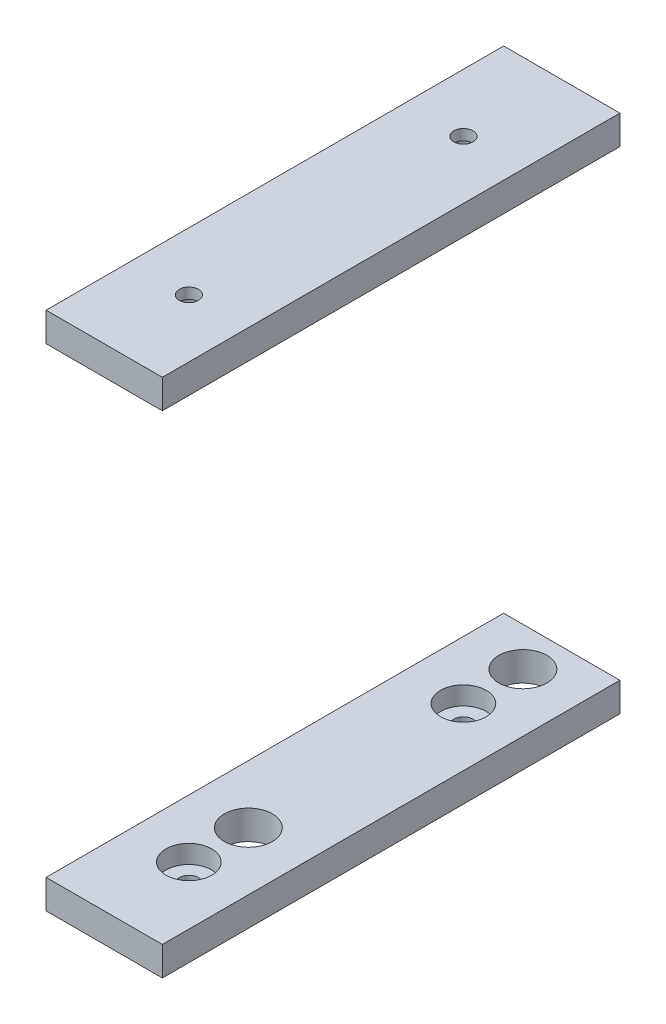
ISO-10303-21;
HEADER;
FILE_DESCRIPTION(('STEP AP214'),'2;1');
FILE_NAME('part.step','',(''),(''),'','','');
FILE_SCHEMA(('AUTOMOTIVE_DESIGN { 1 0 10303 214 1 1 1 1 }'));
ENDSEC;
DATA;
#1=APPLICATION_CONTEXT('core data for automotive mechanical design processes');
#2=APPLICATION_PROTOCOL_DEFINITION('international standard','automotive_design',2000,#1);
#3=PRODUCT_CONTEXT('',#1,'mechanical');
#4=PRODUCT('Part','Part','',(#3));
#5=PRODUCT_RELATED_PRODUCT_CATEGORY('part','',(#4));
#6=PRODUCT_DEFINITION_FORMATION('','',#4);
#7=PRODUCT_DEFINITION_CONTEXT('part definition',#1,'design');
#8=PRODUCT_DEFINITION('design','',#6,#7);
#9=PRODUCT_DEFINITION_SHAPE('','',#8);
#10=(LENGTH_UNIT() NAMED_UNIT(*) SI_UNIT(.MILLI.,.METRE.));
#11=(NAMED_UNIT(*) PLANE_ANGLE_UNIT() SI_UNIT($,.RADIAN.));
#12=(NAMED_UNIT(*) SI_UNIT($,.STERADIAN.) SOLID_ANGLE_UNIT());
#13=UNCERTAINTY_MEASURE_WITH_UNIT(LENGTH_MEASURE(1.E-05),#10,'distance_accuracy_value','');
#14=(GEOMETRIC_REPRESENTATION_CONTEXT(3) GLOBAL_UNCERTAINTY_ASSIGNED_CONTEXT((#13)) GLOBAL_UNIT_ASSIGNED_CONTEXT((#10,
#11,#12)) REPRESENTATION_CONTEXT('',''));
#15=CARTESIAN_POINT('',(0.,0.,0.));
#16=DIRECTION('',(0.,0.,1.));
#17=DIRECTION('',(1.,0.,0.));
#18=AXIS2_PLACEMENT_3D('',#15,#16,#17);
#19=CARTESIAN_POINT('',(104.175,-6.35,-115.));
#20=DIRECTION('',(0.,0.,-1.));
#21=DIRECTION('',(-1.,0.,0.));
#22=AXIS2_PLACEMENT_3D('',#19,#20,#21);
#23=PLANE('',#22);
#24=DIRECTION('',(-1.,0.,0.));
#25=VECTOR('',#24,1.);
#26=CARTESIAN_POINT('',(104.175,0.,-115.));
#27=LINE('',#26,#25);
#28=CARTESIAN_POINT('',(104.175,0.,-115.));
#29=VERTEX_POINT('',#28);
#30=CARTESIAN_POINT('',(78.775,0.,-115.));
#31=VERTEX_POINT('',#30);
#32=EDGE_CURVE('E129',#29,#31,#27,.T.);
#33=ORIENTED_EDGE('',*,*,#32,.F.);
#34=DIRECTION('',(0.,1.,0.));
#35=VECTOR('',#34,1.);
#36=CARTESIAN_POINT('',(104.175,-6.35,-115.));
#37=LINE('',#36,#35);
#38=CARTESIAN_POINT('',(104.175,-6.35,-115.));
#39=VERTEX_POINT('',#38);
#40=EDGE_CURVE('E12',#39,#29,#37,.T.);
#41=ORIENTED_EDGE('',*,*,#40,.F.);
#42=DIRECTION('',(-1.,0.,0.));
#43=VECTOR('',#42,1.);
#44=CARTESIAN_POINT('',(104.175,-6.35,-115.));
#45=LINE('',#44,#43);
#46=CARTESIAN_POINT('',(78.775,-6.35,-115.));
#47=VERTEX_POINT('',#46);
#48=EDGE_CURVE('E118',#39,#47,#45,.T.);
#49=ORIENTED_EDGE('',*,*,#48,.T.);
#50=DIRECTION('',(0.,1.,0.));
#51=VECTOR('',#50,1.);
#52=CARTESIAN_POINT('',(78.775,-6.35,-115.));
#53=LINE('',#52,#51);
#54=EDGE_CURVE('E100',#47,#31,#53,.T.);
#55=ORIENTED_EDGE('',*,*,#54,.T.);
#56=EDGE_LOOP('',(#33,#41,#49,#55));
#57=FACE_BOUND('',#56,.T.);
#58=ADVANCED_FACE('F54',(#57),#23,.T.);
#59=CARTESIAN_POINT('',(104.175,-6.35,-15.));
#60=DIRECTION('',(1.,0.,0.));
#61=DIRECTION('',(0.,0.,-1.));
#62=AXIS2_PLACEMENT_3D('',#59,#60,#61);
#63=PLANE('',#62);
#64=DIRECTION('',(0.,0.,-1.));
#65=VECTOR('',#64,1.);
#66=CARTESIAN_POINT('',(104.175,0.,-15.));
#67=LINE('',#66,#65);
#68=CARTESIAN_POINT('',(104.175,0.,-15.));
#69=VERTEX_POINT('',#68);
#70=EDGE_CURVE('E125',#69,#29,#67,.T.);
#71=ORIENTED_EDGE('',*,*,#70,.F.);
#72=DIRECTION('',(0.,1.,0.));
#73=VECTOR('',#72,1.);
#74=CARTESIAN_POINT('',(104.175,-6.35,-15.));
#75=LINE('',#74,#73);
#76=CARTESIAN_POINT('',(104.175,-6.35,-15.));
#77=VERTEX_POINT('',#76);
#78=EDGE_CURVE('E63',#77,#69,#75,.T.);
#79=ORIENTED_EDGE('',*,*,#78,.F.);
#80=DIRECTION('',(0.,0.,-1.));
#81=VECTOR('',#80,1.);
#82=CARTESIAN_POINT('',(104.175,-6.35,-15.));
#83=LINE('',#82,#81);
#84=EDGE_CURVE('E112',#77,#39,#83,.T.);
#85=ORIENTED_EDGE('',*,*,#84,.T.);
#86=ORIENTED_EDGE('',*,*,#40,.T.);
#87=EDGE_LOOP('',(#71,#79,#85,#86));
#88=FACE_BOUND('',#87,.T.);
#89=ADVANCED_FACE('F202',(#88),#63,.T.);
#90=CARTESIAN_POINT('',(78.775,-6.35,-15.));
#91=DIRECTION('',(0.,0.,1.));
#92=DIRECTION('',(1.,0.,0.));
#93=AXIS2_PLACEMENT_3D('',#90,#91,#92);
#94=PLANE('',#93);
#95=DIRECTION('',(1.,0.,0.));
#96=VECTOR('',#95,1.);
#97=CARTESIAN_POINT('',(78.775,0.,-15.));
#98=LINE('',#97,#96);
#99=CARTESIAN_POINT('',(78.775,0.,-15.));
#100=VERTEX_POINT('',#99);
#101=EDGE_CURVE('E110',#100,#69,#98,.T.);
#102=ORIENTED_EDGE('',*,*,#101,.F.);
#103=DIRECTION('',(0.,1.,0.));
#104=VECTOR('',#103,1.);
#105=CARTESIAN_POINT('',(78.775,-6.35,-15.));
#106=LINE('',#105,#104);
#107=CARTESIAN_POINT('',(78.775,-6.35,-15.));
#108=VERTEX_POINT('',#107);
#109=EDGE_CURVE('E105',#108,#100,#106,.T.);
#110=ORIENTED_EDGE('',*,*,#109,.F.);
#111=DIRECTION('',(1.,0.,0.));
#112=VECTOR('',#111,1.);
#113=CARTESIAN_POINT('',(78.775,-6.35,-15.));
#114=LINE('',#113,#112);
#115=EDGE_CURVE('E102',#108,#77,#114,.T.);
#116=ORIENTED_EDGE('',*,*,#115,.T.);
#117=ORIENTED_EDGE('',*,*,#78,.T.);
#118=EDGE_LOOP('',(#102,#110,#116,#117));
#119=FACE_BOUND('',#118,.T.);
#120=ADVANCED_FACE('F104',(#119),#94,.T.);
#121=CARTESIAN_POINT('',(78.775,-6.35,-115.));
#122=DIRECTION('',(-1.,0.,0.));
#123=DIRECTION('',(0.,0.,1.));
#124=AXIS2_PLACEMENT_3D('',#121,#122,#123);
#125=PLANE('',#124);
#126=DIRECTION('',(0.,0.,1.));
#127=VECTOR('',#126,1.);
#128=CARTESIAN_POINT('',(78.775,0.,-115.));
#129=LINE('',#128,#127);
#130=EDGE_CURVE('E135',#31,#100,#129,.T.);
#131=ORIENTED_EDGE('',*,*,#130,.F.);
#132=ORIENTED_EDGE('',*,*,#54,.F.);
#133=DIRECTION('',(0.,0.,1.));
#134=VECTOR('',#133,1.);
#135=CARTESIAN_POINT('',(78.775,-6.35,-115.));
#136=LINE('',#135,#134);
#137=EDGE_CURVE('E113',#47,#108,#136,.T.);
#138=ORIENTED_EDGE('',*,*,#137,.T.);
#139=ORIENTED_EDGE('',*,*,#109,.T.);
#140=EDGE_LOOP('',(#131,#132,#138,#139));
#141=FACE_BOUND('',#140,.T.);
#142=ADVANCED_FACE('F120',(#141),#125,.T.);
#143=CARTESIAN_POINT('',(0.,-6.35,0.));
#144=DIRECTION('',(0.,1.,0.));
#145=DIRECTION('',(0.,0.,1.));
#146=AXIS2_PLACEMENT_3D('',#143,#144,#145);
#147=PLANE('',#146);
#148=CARTESIAN_POINT('',(91.475,-6.35,-33.5));
#149=DIRECTION('',(0.,-1.,0.));
#150=DIRECTION('',(0.,0.,-1.));
#151=AXIS2_PLACEMENT_3D('',#148,#149,#150);
#152=CIRCLE('',#151,5.);
#153=CARTESIAN_POINT('',(91.475,-6.35,-38.5));
#154=VERTEX_POINT('',#153);
#155=EDGE_CURVE('E167',#154,#154,#152,.T.);
#156=ORIENTED_EDGE('',*,*,#155,.F.);
#157=EDGE_LOOP('',(#156));
#158=FACE_BOUND('',#157,.T.);
#159=CARTESIAN_POINT('',(91.475,-6.35,-93.5));
#160=DIRECTION('',(0.,-1.,0.));
#161=DIRECTION('',(0.,0.,-1.));
#162=AXIS2_PLACEMENT_3D('',#159,#160,#161);
#163=CIRCLE('',#162,5.);
#164=CARTESIAN_POINT('',(91.475,-6.35,-98.5));
#165=VERTEX_POINT('',#164);
#166=EDGE_CURVE('E157',#165,#165,#163,.T.);
#167=ORIENTED_EDGE('',*,*,#166,.F.);
#168=EDGE_LOOP('',(#167));
#169=FACE_BOUND('',#168,.T.);
#170=ORIENTED_EDGE('',*,*,#48,.F.);
#171=ORIENTED_EDGE('',*,*,#84,.F.);
#172=ORIENTED_EDGE('',*,*,#115,.F.);
#173=ORIENTED_EDGE('',*,*,#137,.F.);
#174=EDGE_LOOP('',(#170,#171,#172,#173));
#175=FACE_BOUND('',#174,.T.);
#176=ADVANCED_FACE('F115',(#158,#169,#175),#147,.F.);
#177=CARTESIAN_POINT('',(0.,0.,0.));
#178=DIRECTION('',(0.,1.,0.));
#179=DIRECTION('',(0.,0.,1.));
#180=AXIS2_PLACEMENT_3D('',#177,#178,#179);
#181=PLANE('',#180);
#182=CARTESIAN_POINT('',(91.475,0.,-33.5));
#183=DIRECTION('',(0.,1.,0.));
#184=DIRECTION('',(0.,0.,1.));
#185=AXIS2_PLACEMENT_3D('',#182,#183,#184);
#186=CIRCLE('',#185,2.1);
#187=CARTESIAN_POINT('',(91.475,0.,-31.4));
#188=VERTEX_POINT('',#187);
#189=EDGE_CURVE('E59',#188,#188,#186,.T.);
#190=ORIENTED_EDGE('',*,*,#189,.F.);
#191=EDGE_LOOP('',(#190));
#192=FACE_BOUND('',#191,.T.);
#193=CARTESIAN_POINT('',(91.475,0.,-93.5));
#194=DIRECTION('',(0.,1.,0.));
#195=DIRECTION('',(0.,0.,1.));
#196=AXIS2_PLACEMENT_3D('',#193,#194,#195);
#197=CIRCLE('',#196,2.1);
#198=CARTESIAN_POINT('',(91.475,0.,-91.4));
#199=VERTEX_POINT('',#198);
#200=EDGE_CURVE('E131',#199,#199,#197,.T.);
#201=ORIENTED_EDGE('',*,*,#200,.F.);
#202=EDGE_LOOP('',(#201));
#203=FACE_BOUND('',#202,.T.);
#204=ORIENTED_EDGE('',*,*,#32,.T.);
#205=ORIENTED_EDGE('',*,*,#130,.T.);
#206=ORIENTED_EDGE('',*,*,#101,.T.);
#207=ORIENTED_EDGE('',*,*,#70,.T.);
#208=EDGE_LOOP('',(#204,#205,#206,#207));
#209=FACE_BOUND('',#208,.T.);
#210=ADVANCED_FACE('F177',(#192,#203,#209),#181,.T.);
#211=CARTESIAN_POINT('',(91.475,-6.35,-93.5));
#212=DIRECTION('',(0.,-1.,0.));
#213=DIRECTION('',(0.,0.,-1.));
#214=AXIS2_PLACEMENT_3D('',#211,#212,#213);
#215=CYLINDRICAL_SURFACE('',#214,2.1);
#216=ORIENTED_EDGE('',*,*,#200,.T.);
#217=EDGE_LOOP('',(#216));
#218=FACE_BOUND('',#217,.T.);
#219=CARTESIAN_POINT('',(91.475,-2.35,-93.5));
#220=DIRECTION('',(0.,-1.,0.));
#221=DIRECTION('',(0.,0.,-1.));
#222=AXIS2_PLACEMENT_3D('',#219,#220,#221);
#223=CIRCLE('',#222,2.1);
#224=CARTESIAN_POINT('',(91.475,-2.35,-95.6));
#225=VERTEX_POINT('',#224);
#226=EDGE_CURVE('E147',#225,#225,#223,.T.);
#227=ORIENTED_EDGE('',*,*,#226,.T.);
#228=EDGE_LOOP('',(#227));
#229=FACE_BOUND('',#228,.T.);
#230=ADVANCED_FACE('F198',(#218,#229),#215,.F.);
#231=CARTESIAN_POINT('',(93.575,-2.35,-93.5));
#232=DIRECTION('',(0.,1.,0.));
#233=DIRECTION('',(0.,0.,1.));
#234=AXIS2_PLACEMENT_3D('',#231,#232,#233);
#235=PLANE('',#234);
#236=ORIENTED_EDGE('',*,*,#226,.F.);
#237=EDGE_LOOP('',(#236));
#238=FACE_BOUND('',#237,.T.);
#239=CARTESIAN_POINT('',(91.475,-2.35,-93.5));
#240=DIRECTION('',(0.,-1.,0.));
#241=DIRECTION('',(0.,0.,-1.));
#242=AXIS2_PLACEMENT_3D('',#239,#240,#241);
#243=CIRCLE('',#242,5.);
#244=CARTESIAN_POINT('',(91.475,-2.35,-98.5));
#245=VERTEX_POINT('',#244);
#246=EDGE_CURVE('E153',#245,#245,#243,.T.);
#247=ORIENTED_EDGE('',*,*,#246,.T.);
#248=EDGE_LOOP('',(#247));
#249=FACE_BOUND('',#248,.T.);
#250=ADVANCED_FACE('F187',(#238,#249),#235,.F.);
#251=CARTESIAN_POINT('',(91.475,-6.35,-93.5));
#252=DIRECTION('',(0.,-1.,0.));
#253=DIRECTION('',(0.,0.,-1.));
#254=AXIS2_PLACEMENT_3D('',#251,#252,#253);
#255=CYLINDRICAL_SURFACE('',#254,5.);
#256=ORIENTED_EDGE('',*,*,#246,.F.);
#257=EDGE_LOOP('',(#256));
#258=FACE_BOUND('',#257,.T.);
#259=ORIENTED_EDGE('',*,*,#166,.T.);
#260=EDGE_LOOP('',(#259));
#261=FACE_BOUND('',#260,.T.);
#262=ADVANCED_FACE('F182',(#258,#261),#255,.F.);
#263=CARTESIAN_POINT('',(91.475,-6.35,-33.5));
#264=DIRECTION('',(0.,-1.,0.));
#265=DIRECTION('',(0.,0.,-1.));
#266=AXIS2_PLACEMENT_3D('',#263,#264,#265);
#267=CYLINDRICAL_SURFACE('',#266,2.1);
#268=ORIENTED_EDGE('',*,*,#189,.T.);
#269=EDGE_LOOP('',(#268));
#270=FACE_BOUND('',#269,.T.);
#271=CARTESIAN_POINT('',(91.475,-2.35,-33.5));
#272=DIRECTION('',(0.,-1.,0.));
#273=DIRECTION('',(0.,0.,-1.));
#274=AXIS2_PLACEMENT_3D('',#271,#272,#273);
#275=CIRCLE('',#274,2.1);
#276=CARTESIAN_POINT('',(91.475,-2.35,-35.6));
#277=VERTEX_POINT('',#276);
#278=EDGE_CURVE('E162',#277,#277,#275,.T.);
#279=ORIENTED_EDGE('',*,*,#278,.T.);
#280=EDGE_LOOP('',(#279));
#281=FACE_BOUND('',#280,.T.);
#282=ADVANCED_FACE('F184',(#270,#281),#267,.F.);
#283=CARTESIAN_POINT('',(93.575,-2.35,-33.5));
#284=DIRECTION('',(0.,1.,0.));
#285=DIRECTION('',(0.,0.,1.));
#286=AXIS2_PLACEMENT_3D('',#283,#284,#285);
#287=PLANE('',#286);
#288=ORIENTED_EDGE('',*,*,#278,.F.);
#289=EDGE_LOOP('',(#288));
#290=FACE_BOUND('',#289,.T.);
#291=CARTESIAN_POINT('',(91.475,-2.35,-33.5));
#292=DIRECTION('',(0.,-1.,0.));
#293=DIRECTION('',(0.,0.,-1.));
#294=AXIS2_PLACEMENT_3D('',#291,#292,#293);
#295=CIRCLE('',#294,5.);
#296=CARTESIAN_POINT('',(91.475,-2.35,-38.5));
#297=VERTEX_POINT('',#296);
#298=EDGE_CURVE('E168',#297,#297,#295,.T.);
#299=ORIENTED_EDGE('',*,*,#298,.T.);
#300=EDGE_LOOP('',(#299));
#301=FACE_BOUND('',#300,.T.);
#302=ADVANCED_FACE('F194',(#290,#301),#287,.F.);
#303=CARTESIAN_POINT('',(91.475,-6.35,-33.5));
#304=DIRECTION('',(0.,-1.,0.));
#305=DIRECTION('',(0.,0.,-1.));
#306=AXIS2_PLACEMENT_3D('',#303,#304,#305);
#307=CYLINDRICAL_SURFACE('',#306,5.);
#308=ORIENTED_EDGE('',*,*,#298,.F.);
#309=EDGE_LOOP('',(#308));
#310=FACE_BOUND('',#309,.T.);
#311=ORIENTED_EDGE('',*,*,#155,.T.);
#312=EDGE_LOOP('',(#311));
#313=FACE_BOUND('',#312,.T.);
#314=ADVANCED_FACE('F174',(#310,#313),#307,.F.);
#315=CLOSED_SHELL('',(#58,#89,#120,#142,#176,#210,#230,#250,#262,#282,#302,#314));
#316=MANIFOLD_SOLID_BREP('B2',#315);
#317=CARTESIAN_POINT('',(104.175,-107.35,-15.));
#318=DIRECTION('',(0.,0.,1.));
#319=DIRECTION('',(1.,0.,0.));
#320=AXIS2_PLACEMENT_3D('',#317,#318,#319);
#321=PLANE('',#320);
#322=DIRECTION('',(-1.,0.,0.));
#323=VECTOR('',#322,1.);
#324=CARTESIAN_POINT('',(104.175,-113.7,-15.));
#325=LINE('',#324,#323);
#326=CARTESIAN_POINT('',(104.175,-113.7,-15.));
#327=VERTEX_POINT('',#326);
#328=CARTESIAN_POINT('',(78.775,-113.7,-15.));
#329=VERTEX_POINT('',#328);
#330=EDGE_CURVE('E366',#327,#329,#325,.T.);
#331=ORIENTED_EDGE('',*,*,#330,.F.);
#332=DIRECTION('',(0.,-1.,0.));
#333=VECTOR('',#332,1.);
#334=CARTESIAN_POINT('',(104.175,-107.35,-15.));
#335=LINE('',#334,#333);
#336=CARTESIAN_POINT('',(104.175,-107.35,-15.));
#337=VERTEX_POINT('',#336);
#338=EDGE_CURVE('E52',#337,#327,#335,.T.);
#339=ORIENTED_EDGE('',*,*,#338,.F.);
#340=DIRECTION('',(-1.,0.,0.));
#341=VECTOR('',#340,1.);
#342=CARTESIAN_POINT('',(104.175,-107.35,-15.));
#343=LINE('',#342,#341);
#344=CARTESIAN_POINT('',(78.775,-107.35,-15.));
#345=VERTEX_POINT('',#344);
#346=EDGE_CURVE('E360',#337,#345,#343,.T.);
#347=ORIENTED_EDGE('',*,*,#346,.T.);
#348=DIRECTION('',(0.,-1.,0.));
#349=VECTOR('',#348,1.);
#350=CARTESIAN_POINT('',(78.775,-107.35,-15.));
#351=LINE('',#350,#349);
#352=EDGE_CURVE('E302',#345,#329,#351,.T.);
#353=ORIENTED_EDGE('',*,*,#352,.T.);
#354=EDGE_LOOP('',(#331,#339,#347,#353));
#355=FACE_BOUND('',#354,.T.);
#356=ADVANCED_FACE('F301',(#355),#321,.T.);
#357=CARTESIAN_POINT('',(104.175,-107.35,-115.));
#358=DIRECTION('',(1.,0.,0.));
#359=DIRECTION('',(0.,0.,-1.));
#360=AXIS2_PLACEMENT_3D('',#357,#358,#359);
#361=PLANE('',#360);
#362=DIRECTION('',(0.,0.,1.));
#363=VECTOR('',#362,1.);
#364=CARTESIAN_POINT('',(104.175,-113.7,-115.));
#365=LINE('',#364,#363);
#366=CARTESIAN_POINT('',(104.175,-113.7,-115.));
#367=VERTEX_POINT('',#366);
#368=EDGE_CURVE('E363',#367,#327,#365,.T.);
#369=ORIENTED_EDGE('',*,*,#368,.F.);
#370=DIRECTION('',(0.,-1.,0.));
#371=VECTOR('',#370,1.);
#372=CARTESIAN_POINT('',(104.175,-107.35,-115.));
#373=LINE('',#372,#371);
#374=CARTESIAN_POINT('',(104.175,-107.35,-115.));
#375=VERTEX_POINT('',#374);
#376=EDGE_CURVE('E309',#375,#367,#373,.T.);
#377=ORIENTED_EDGE('',*,*,#376,.F.);
#378=DIRECTION('',(0.,0.,1.));
#379=VECTOR('',#378,1.);
#380=CARTESIAN_POINT('',(104.175,-107.35,-115.));
#381=LINE('',#380,#379);
#382=EDGE_CURVE('E358',#375,#337,#381,.T.);
#383=ORIENTED_EDGE('',*,*,#382,.T.);
#384=ORIENTED_EDGE('',*,*,#338,.T.);
#385=EDGE_LOOP('',(#369,#377,#383,#384));
#386=FACE_BOUND('',#385,.T.);
#387=ADVANCED_FACE('F380',(#386),#361,.T.);
#388=CARTESIAN_POINT('',(78.775,-107.35,-115.));
#389=DIRECTION('',(0.,0.,-1.));
#390=DIRECTION('',(-1.,0.,0.));
#391=AXIS2_PLACEMENT_3D('',#388,#389,#390);
#392=PLANE('',#391);
#393=DIRECTION('',(1.,0.,0.));
#394=VECTOR('',#393,1.);
#395=CARTESIAN_POINT('',(78.775,-113.7,-115.));
#396=LINE('',#395,#394);
#397=CARTESIAN_POINT('',(78.775,-113.7,-115.));
#398=VERTEX_POINT('',#397);
#399=EDGE_CURVE('E352',#398,#367,#396,.T.);
#400=ORIENTED_EDGE('',*,*,#399,.F.);
#401=DIRECTION('',(0.,-1.,0.));
#402=VECTOR('',#401,1.);
#403=CARTESIAN_POINT('',(78.775,-107.35,-115.));
#404=LINE('',#403,#402);
#405=CARTESIAN_POINT('',(78.775,-107.35,-115.));
#406=VERTEX_POINT('',#405);
#407=EDGE_CURVE('E348',#406,#398,#404,.T.);
#408=ORIENTED_EDGE('',*,*,#407,.F.);
#409=DIRECTION('',(1.,0.,0.));
#410=VECTOR('',#409,1.);
#411=CARTESIAN_POINT('',(78.775,-107.35,-115.));
#412=LINE('',#411,#410);
#413=EDGE_CURVE('E347',#406,#375,#412,.T.);
#414=ORIENTED_EDGE('',*,*,#413,.T.);
#415=ORIENTED_EDGE('',*,*,#376,.T.);
#416=EDGE_LOOP('',(#400,#408,#414,#415));
#417=FACE_BOUND('',#416,.T.);
#418=ADVANCED_FACE('F346',(#417),#392,.T.);
#419=CARTESIAN_POINT('',(78.775,-107.35,-15.));
#420=DIRECTION('',(-1.,0.,0.));
#421=DIRECTION('',(0.,0.,1.));
#422=AXIS2_PLACEMENT_3D('',#419,#420,#421);
#423=PLANE('',#422);
#424=DIRECTION('',(0.,0.,-1.));
#425=VECTOR('',#424,1.);
#426=CARTESIAN_POINT('',(78.775,-113.7,-15.));
#427=LINE('',#426,#425);
#428=EDGE_CURVE('E367',#329,#398,#427,.T.);
#429=ORIENTED_EDGE('',*,*,#428,.F.);
#430=ORIENTED_EDGE('',*,*,#352,.F.);
#431=DIRECTION('',(0.,0.,-1.));
#432=VECTOR('',#431,1.);
#433=CARTESIAN_POINT('',(78.775,-107.35,-15.));
#434=LINE('',#433,#432);
#435=EDGE_CURVE('E353',#345,#406,#434,.T.);
#436=ORIENTED_EDGE('',*,*,#435,.T.);
#437=ORIENTED_EDGE('',*,*,#407,.T.);
#438=EDGE_LOOP('',(#429,#430,#436,#437));
#439=FACE_BOUND('',#438,.T.);
#440=ADVANCED_FACE('F356',(#439),#423,.T.);
#441=CARTESIAN_POINT('',(0.,-107.35,0.));
#442=DIRECTION('',(0.,-1.,0.));
#443=DIRECTION('',(0.,0.,-1.));
#444=AXIS2_PLACEMENT_3D('',#441,#442,#443);
#445=PLANE('',#444);
#446=CARTESIAN_POINT('',(91.475,-107.35,-33.5));
#447=DIRECTION('',(0.,1.,0.));
#448=DIRECTION('',(0.,0.,1.));
#449=AXIS2_PLACEMENT_3D('',#446,#447,#448);
#450=CIRCLE('',#449,5.);
#451=CARTESIAN_POINT('',(91.475,-107.35,-28.5));
#452=VERTEX_POINT('',#451);
#453=EDGE_CURVE('E440',#452,#452,#450,.T.);
#454=ORIENTED_EDGE('',*,*,#453,.F.);
#455=EDGE_LOOP('',(#454));
#456=FACE_BOUND('',#455,.T.);
#457=CARTESIAN_POINT('',(91.475,-107.35,-93.5));
#458=DIRECTION('',(0.,1.,0.));
#459=DIRECTION('',(0.,0.,1.));
#460=AXIS2_PLACEMENT_3D('',#457,#458,#459);
#461=CIRCLE('',#460,5.);
#462=CARTESIAN_POINT('',(91.475,-107.35,-88.5));
#463=VERTEX_POINT('',#462);
#464=EDGE_CURVE('E450',#463,#463,#461,.T.);
#465=ORIENTED_EDGE('',*,*,#464,.F.);
#466=EDGE_LOOP('',(#465));
#467=FACE_BOUND('',#466,.T.);
#468=CARTESIAN_POINT('',(91.475,-107.35,-106.5));
#469=DIRECTION('',(0.,-1.,0.));
#470=DIRECTION('',(0.,0.,-1.));
#471=AXIS2_PLACEMENT_3D('',#468,#469,#470);
#472=CIRCLE('',#471,5.24999999999999);
#473=CARTESIAN_POINT('',(91.475,-107.35,-111.75));
#474=VERTEX_POINT('',#473);
#475=EDGE_CURVE('E464',#474,#474,#472,.T.);
#476=ORIENTED_EDGE('',*,*,#475,.T.);
#477=EDGE_LOOP('',(#476));
#478=FACE_BOUND('',#477,.T.);
#479=CARTESIAN_POINT('',(91.475,-107.35,-46.5));
#480=DIRECTION('',(0.,-1.,0.));
#481=DIRECTION('',(0.,0.,-1.));
#482=AXIS2_PLACEMENT_3D('',#479,#480,#481);
#483=CIRCLE('',#482,5.24999999999999);
#484=CARTESIAN_POINT('',(91.475,-107.35,-51.75));
#485=VERTEX_POINT('',#484);
#486=EDGE_CURVE('E369',#485,#485,#483,.T.);
#487=ORIENTED_EDGE('',*,*,#486,.T.);
#488=EDGE_LOOP('',(#487));
#489=FACE_BOUND('',#488,.T.);
#490=ORIENTED_EDGE('',*,*,#346,.F.);
#491=ORIENTED_EDGE('',*,*,#382,.F.);
#492=ORIENTED_EDGE('',*,*,#413,.F.);
#493=ORIENTED_EDGE('',*,*,#435,.F.);
#494=EDGE_LOOP('',(#490,#491,#492,#493));
#495=FACE_BOUND('',#494,.T.);
#496=ADVANCED_FACE('F351',(#456,#467,#478,#489,#495),#445,.F.);
#497=CARTESIAN_POINT('',(0.,-113.7,0.));
#498=DIRECTION('',(0.,-1.,0.));
#499=DIRECTION('',(0.,0.,-1.));
#500=AXIS2_PLACEMENT_3D('',#497,#498,#499);
#501=PLANE('',#500);
#502=CARTESIAN_POINT('',(91.475,-113.7,-33.5));
#503=DIRECTION('',(0.,1.,0.));
#504=DIRECTION('',(0.,0.,1.));
#505=AXIS2_PLACEMENT_3D('',#502,#503,#504);
#506=CIRCLE('',#505,2.1);
#507=CARTESIAN_POINT('',(91.475,-113.7,-31.4));
#508=VERTEX_POINT('',#507);
#509=EDGE_CURVE('E443',#508,#508,#506,.T.);
#510=ORIENTED_EDGE('',*,*,#509,.T.);
#511=EDGE_LOOP('',(#510));
#512=FACE_BOUND('',#511,.T.);
#513=CARTESIAN_POINT('',(91.475,-113.7,-93.5));
#514=DIRECTION('',(0.,1.,0.));
#515=DIRECTION('',(0.,0.,1.));
#516=AXIS2_PLACEMENT_3D('',#513,#514,#515);
#517=CIRCLE('',#516,2.1);
#518=CARTESIAN_POINT('',(91.475,-113.7,-91.4));
#519=VERTEX_POINT('',#518);
#520=EDGE_CURVE('E458',#519,#519,#517,.T.);
#521=ORIENTED_EDGE('',*,*,#520,.T.);
#522=EDGE_LOOP('',(#521));
#523=FACE_BOUND('',#522,.T.);
#524=CARTESIAN_POINT('',(91.475,-113.7,-106.5));
#525=DIRECTION('',(0.,-1.,0.));
#526=DIRECTION('',(0.,0.,-1.));
#527=AXIS2_PLACEMENT_3D('',#524,#525,#526);
#528=CIRCLE('',#527,5.24999999999999);
#529=CARTESIAN_POINT('',(91.475,-113.7,-111.75));
#530=VERTEX_POINT('',#529);
#531=EDGE_CURVE('E457',#530,#530,#528,.T.);
#532=ORIENTED_EDGE('',*,*,#531,.F.);
#533=EDGE_LOOP('',(#532));
#534=FACE_BOUND('',#533,.T.);
#535=CARTESIAN_POINT('',(91.475,-113.7,-46.5));
#536=DIRECTION('',(0.,-1.,0.));
#537=DIRECTION('',(0.,0.,-1.));
#538=AXIS2_PLACEMENT_3D('',#535,#536,#537);
#539=CIRCLE('',#538,5.24999999999999);
#540=CARTESIAN_POINT('',(91.475,-113.7,-51.75));
#541=VERTEX_POINT('',#540);
#542=EDGE_CURVE('E463',#541,#541,#539,.T.);
#543=ORIENTED_EDGE('',*,*,#542,.F.);
#544=EDGE_LOOP('',(#543));
#545=FACE_BOUND('',#544,.T.);
#546=ORIENTED_EDGE('',*,*,#330,.T.);
#547=ORIENTED_EDGE('',*,*,#428,.T.);
#548=ORIENTED_EDGE('',*,*,#399,.T.);
#549=ORIENTED_EDGE('',*,*,#368,.T.);
#550=EDGE_LOOP('',(#546,#547,#548,#549));
#551=FACE_BOUND('',#550,.T.);
#552=ADVANCED_FACE('F376',(#512,#523,#534,#545,#551),#501,.T.);
#553=CARTESIAN_POINT('',(91.475,-113.7,-46.5));
#554=DIRECTION('',(0.,-1.,0.));
#555=DIRECTION('',(0.,0.,-1.));
#556=AXIS2_PLACEMENT_3D('',#553,#554,#555);
#557=CYLINDRICAL_SURFACE('',#556,5.24999999999999);
#558=ORIENTED_EDGE('',*,*,#486,.F.);
#559=EDGE_LOOP('',(#558));
#560=FACE_BOUND('',#559,.T.);
#561=ORIENTED_EDGE('',*,*,#542,.T.);
#562=EDGE_LOOP('',(#561));
#563=FACE_BOUND('',#562,.T.);
#564=ADVANCED_FACE('F399',(#560,#563),#557,.F.);
#565=CARTESIAN_POINT('',(91.475,-113.7,-106.5));
#566=DIRECTION('',(0.,-1.,0.));
#567=DIRECTION('',(0.,0.,-1.));
#568=AXIS2_PLACEMENT_3D('',#565,#566,#567);
#569=CYLINDRICAL_SURFACE('',#568,5.24999999999999);
#570=ORIENTED_EDGE('',*,*,#475,.F.);
#571=EDGE_LOOP('',(#570));
#572=FACE_BOUND('',#571,.T.);
#573=ORIENTED_EDGE('',*,*,#531,.T.);
#574=EDGE_LOOP('',(#573));
#575=FACE_BOUND('',#574,.T.);
#576=ADVANCED_FACE('F401',(#572,#575),#569,.F.);
#577=CARTESIAN_POINT('',(91.475,-107.35,-93.5));
#578=DIRECTION('',(0.,1.,0.));
#579=DIRECTION('',(0.,0.,1.));
#580=AXIS2_PLACEMENT_3D('',#577,#578,#579);
#581=CYLINDRICAL_SURFACE('',#580,2.10000000000001);
#582=ORIENTED_EDGE('',*,*,#520,.F.);
#583=EDGE_LOOP('',(#582));
#584=FACE_BOUND('',#583,.T.);
#585=CARTESIAN_POINT('',(91.475,-111.35,-93.5));
#586=DIRECTION('',(0.,1.,0.));
#587=DIRECTION('',(0.,0.,1.));
#588=AXIS2_PLACEMENT_3D('',#585,#586,#587);
#589=CIRCLE('',#588,2.10000000000002);
#590=CARTESIAN_POINT('',(91.475,-111.35,-91.4));
#591=VERTEX_POINT('',#590);
#592=EDGE_CURVE('E454',#591,#591,#589,.T.);
#593=ORIENTED_EDGE('',*,*,#592,.T.);
#594=EDGE_LOOP('',(#593));
#595=FACE_BOUND('',#594,.T.);
#596=ADVANCED_FACE('F407',(#584,#595),#581,.F.);
#597=CARTESIAN_POINT('',(93.575,-111.35,-93.5));
#598=DIRECTION('',(0.,-1.,0.));
#599=DIRECTION('',(0.,0.,-1.));
#600=AXIS2_PLACEMENT_3D('',#597,#598,#599);
#601=PLANE('',#600);
#602=ORIENTED_EDGE('',*,*,#592,.F.);
#603=EDGE_LOOP('',(#602));
#604=FACE_BOUND('',#603,.T.);
#605=CARTESIAN_POINT('',(91.475,-111.35,-93.5));
#606=DIRECTION('',(0.,1.,0.));
#607=DIRECTION('',(0.,0.,1.));
#608=AXIS2_PLACEMENT_3D('',#605,#606,#607);
#609=CIRCLE('',#608,5.);
#610=CARTESIAN_POINT('',(91.475,-111.35,-88.5));
#611=VERTEX_POINT('',#610);
#612=EDGE_CURVE('E448',#611,#611,#609,.T.);
#613=ORIENTED_EDGE('',*,*,#612,.T.);
#614=EDGE_LOOP('',(#613));
#615=FACE_BOUND('',#614,.T.);
#616=ADVANCED_FACE('F408',(#604,#615),#601,.F.);
#617=CARTESIAN_POINT('',(91.475,-107.35,-93.5));
#618=DIRECTION('',(0.,1.,0.));
#619=DIRECTION('',(0.,0.,1.));
#620=AXIS2_PLACEMENT_3D('',#617,#618,#619);
#621=CYLINDRICAL_SURFACE('',#620,5.);
#622=ORIENTED_EDGE('',*,*,#612,.F.);
#623=EDGE_LOOP('',(#622));
#624=FACE_BOUND('',#623,.T.);
#625=ORIENTED_EDGE('',*,*,#464,.T.);
#626=EDGE_LOOP('',(#625));
#627=FACE_BOUND('',#626,.T.);
#628=ADVANCED_FACE('F412',(#624,#627),#621,.F.);
#629=CARTESIAN_POINT('',(91.475,-107.35,-33.5));
#630=DIRECTION('',(0.,1.,0.));
#631=DIRECTION('',(0.,0.,1.));
#632=AXIS2_PLACEMENT_3D('',#629,#630,#631);
#633=CYLINDRICAL_SURFACE('',#632,2.10000000000001);
#634=ORIENTED_EDGE('',*,*,#509,.F.);
#635=EDGE_LOOP('',(#634));
#636=FACE_BOUND('',#635,.T.);
#637=CARTESIAN_POINT('',(91.475,-111.35,-33.5));
#638=DIRECTION('',(0.,1.,0.));
#639=DIRECTION('',(0.,0.,1.));
#640=AXIS2_PLACEMENT_3D('',#637,#638,#639);
#641=CIRCLE('',#640,2.10000000000002);
#642=CARTESIAN_POINT('',(91.475,-111.35,-31.4));
#643=VERTEX_POINT('',#642);
#644=EDGE_CURVE('E437',#643,#643,#641,.T.);
#645=ORIENTED_EDGE('',*,*,#644,.T.);
#646=EDGE_LOOP('',(#645));
#647=FACE_BOUND('',#646,.T.);
#648=ADVANCED_FACE('F420',(#636,#647),#633,.F.);
#649=CARTESIAN_POINT('',(93.575,-111.35,-33.5));
#650=DIRECTION('',(0.,-1.,0.));
#651=DIRECTION('',(0.,0.,-1.));
#652=AXIS2_PLACEMENT_3D('',#649,#650,#651);
#653=PLANE('',#652);
#654=ORIENTED_EDGE('',*,*,#644,.F.);
#655=EDGE_LOOP('',(#654));
#656=FACE_BOUND('',#655,.T.);
#657=CARTESIAN_POINT('',(91.475,-111.35,-33.5));
#658=DIRECTION('',(0.,1.,0.));
#659=DIRECTION('',(0.,0.,1.));
#660=AXIS2_PLACEMENT_3D('',#657,#658,#659);
#661=CIRCLE('',#660,5.);
#662=CARTESIAN_POINT('',(91.475,-111.35,-28.5));
#663=VERTEX_POINT('',#662);
#664=EDGE_CURVE('E434',#663,#663,#661,.T.);
#665=ORIENTED_EDGE('',*,*,#664,.T.);
#666=EDGE_LOOP('',(#665));
#667=FACE_BOUND('',#666,.T.);
#668=ADVANCED_FACE('F422',(#656,#667),#653,.F.);
#669=CARTESIAN_POINT('',(91.475,-107.35,-33.5));
#670=DIRECTION('',(0.,1.,0.));
#671=DIRECTION('',(0.,0.,1.));
#672=AXIS2_PLACEMENT_3D('',#669,#670,#671);
#673=CYLINDRICAL_SURFACE('',#672,5.);
#674=ORIENTED_EDGE('',*,*,#664,.F.);
#675=EDGE_LOOP('',(#674));
#676=FACE_BOUND('',#675,.T.);
#677=ORIENTED_EDGE('',*,*,#453,.T.);
#678=EDGE_LOOP('',(#677));
#679=FACE_BOUND('',#678,.T.);
#680=ADVANCED_FACE('F428',(#676,#679),#673,.F.);
#681=CLOSED_SHELL('',(#356,#387,#418,#440,#496,#552,#564,#576,#596,#616,#628,#648,#668,#680));
#682=MANIFOLD_SOLID_BREP('B6',#681);
#683=ADVANCED_BREP_SHAPE_REPRESENTATION('',(#18,#316,#682),#14);
#684=SHAPE_DEFINITION_REPRESENTATION(#9,#683);
ENDSEC;
END-ISO-10303-21;
